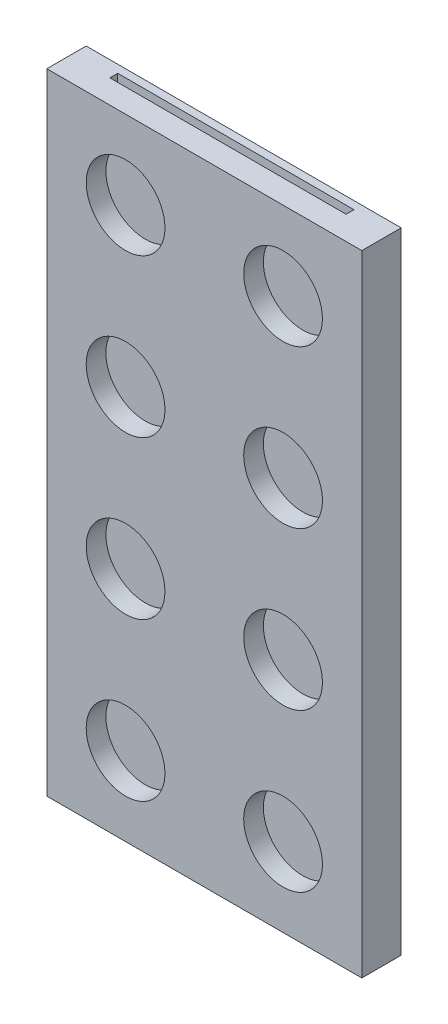
ISO-10303-21;
HEADER;
FILE_DESCRIPTION(('STEP AP214'),'2;1');
FILE_NAME('part.step','',(''),(''),'','','');
FILE_SCHEMA(('AUTOMOTIVE_DESIGN { 1 0 10303 214 1 1 1 1 }'));
ENDSEC;
DATA;
#1=APPLICATION_CONTEXT('core data for automotive mechanical design processes');
#2=APPLICATION_PROTOCOL_DEFINITION('international standard','automotive_design',2000,#1);
#3=PRODUCT_CONTEXT('',#1,'mechanical');
#4=PRODUCT('Part','Part','',(#3));
#5=PRODUCT_RELATED_PRODUCT_CATEGORY('part','',(#4));
#6=PRODUCT_DEFINITION_FORMATION('','',#4);
#7=PRODUCT_DEFINITION_CONTEXT('part definition',#1,'design');
#8=PRODUCT_DEFINITION('design','',#6,#7);
#9=PRODUCT_DEFINITION_SHAPE('','',#8);
#10=(LENGTH_UNIT() NAMED_UNIT(*) SI_UNIT(.MILLI.,.METRE.));
#11=(NAMED_UNIT(*) PLANE_ANGLE_UNIT() SI_UNIT($,.RADIAN.));
#12=(NAMED_UNIT(*) SI_UNIT($,.STERADIAN.) SOLID_ANGLE_UNIT());
#13=UNCERTAINTY_MEASURE_WITH_UNIT(LENGTH_MEASURE(1.E-05),#10,'distance_accuracy_value','');
#14=(GEOMETRIC_REPRESENTATION_CONTEXT(3) GLOBAL_UNCERTAINTY_ASSIGNED_CONTEXT((#13)) GLOBAL_UNIT_ASSIGNED_CONTEXT((#10,
#11,#12)) REPRESENTATION_CONTEXT('',''));
#15=CARTESIAN_POINT('',(0.,0.,0.));
#16=DIRECTION('',(0.,0.,1.));
#17=DIRECTION('',(1.,0.,0.));
#18=AXIS2_PLACEMENT_3D('',#15,#16,#17);
#19=CARTESIAN_POINT('',(0.,0.,6.35));
#20=DIRECTION('',(0.,0.,-1.));
#21=DIRECTION('',(-1.,0.,0.));
#22=AXIS2_PLACEMENT_3D('',#19,#20,#21);
#23=PLANE('',#22);
#24=CARTESIAN_POINT('',(12.7,63.5,6.35));
#25=DIRECTION('',(0.,0.,-1.));
#26=DIRECTION('',(-1.,0.,0.));
#27=AXIS2_PLACEMENT_3D('',#24,#25,#26);
#28=CIRCLE('',#27,6.35);
#29=CARTESIAN_POINT('',(6.35,63.5,6.35));
#30=VERTEX_POINT('',#29);
#31=EDGE_CURVE('E228',#30,#30,#28,.T.);
#32=ORIENTED_EDGE('',*,*,#31,.T.);
#33=EDGE_LOOP('',(#32));
#34=FACE_BOUND('',#33,.T.);
#35=CARTESIAN_POINT('',(12.7,38.1,6.35));
#36=DIRECTION('',(0.,0.,1.));
#37=DIRECTION('',(1.,0.,0.));
#38=AXIS2_PLACEMENT_3D('',#35,#36,#37);
#39=CIRCLE('',#38,6.35);
#40=CARTESIAN_POINT('',(19.05,38.1,6.35));
#41=VERTEX_POINT('',#40);
#42=EDGE_CURVE('E212',#41,#41,#39,.T.);
#43=ORIENTED_EDGE('',*,*,#42,.F.);
#44=EDGE_LOOP('',(#43));
#45=FACE_BOUND('',#44,.T.);
#46=CARTESIAN_POINT('',(38.1,63.5,6.35));
#47=DIRECTION('',(0.,0.,-1.));
#48=DIRECTION('',(-1.,0.,0.));
#49=AXIS2_PLACEMENT_3D('',#46,#47,#48);
#50=CIRCLE('',#49,6.35);
#51=CARTESIAN_POINT('',(31.75,63.5,6.35));
#52=VERTEX_POINT('',#51);
#53=EDGE_CURVE('E220',#52,#52,#50,.T.);
#54=ORIENTED_EDGE('',*,*,#53,.T.);
#55=EDGE_LOOP('',(#54));
#56=FACE_BOUND('',#55,.T.);
#57=CARTESIAN_POINT('',(38.1,38.1,6.35));
#58=DIRECTION('',(0.,0.,1.));
#59=DIRECTION('',(1.,0.,0.));
#60=AXIS2_PLACEMENT_3D('',#57,#58,#59);
#61=CIRCLE('',#60,6.35);
#62=CARTESIAN_POINT('',(44.45,38.1,6.35));
#63=VERTEX_POINT('',#62);
#64=EDGE_CURVE('E204',#63,#63,#61,.T.);
#65=ORIENTED_EDGE('',*,*,#64,.F.);
#66=EDGE_LOOP('',(#65));
#67=FACE_BOUND('',#66,.T.);
#68=CARTESIAN_POINT('',(12.7,12.7,6.35));
#69=DIRECTION('',(0.,0.,-1.));
#70=DIRECTION('',(-1.,0.,0.));
#71=AXIS2_PLACEMENT_3D('',#68,#69,#70);
#72=CIRCLE('',#71,6.35);
#73=CARTESIAN_POINT('',(6.35,12.7,6.35));
#74=VERTEX_POINT('',#73);
#75=EDGE_CURVE('E196',#74,#74,#72,.T.);
#76=ORIENTED_EDGE('',*,*,#75,.T.);
#77=EDGE_LOOP('',(#76));
#78=FACE_BOUND('',#77,.T.);
#79=DIRECTION('',(0.,-1.,0.));
#80=VECTOR('',#79,1.);
#81=CARTESIAN_POINT('',(0.,0.,6.35));
#82=LINE('',#81,#80);
#83=CARTESIAN_POINT('',(0.,101.6,6.35));
#84=VERTEX_POINT('',#83);
#85=CARTESIAN_POINT('',(0.,0.,6.35));
#86=VERTEX_POINT('',#85);
#87=EDGE_CURVE('E252',#84,#86,#82,.T.);
#88=ORIENTED_EDGE('',*,*,#87,.T.);
#89=DIRECTION('',(1.,0.,0.));
#90=VECTOR('',#89,1.);
#91=CARTESIAN_POINT('',(0.,0.,6.35));
#92=LINE('',#91,#90);
#93=CARTESIAN_POINT('',(50.8,0.,6.35));
#94=VERTEX_POINT('',#93);
#95=EDGE_CURVE('E256',#86,#94,#92,.T.);
#96=ORIENTED_EDGE('',*,*,#95,.T.);
#97=DIRECTION('',(0.,1.,0.));
#98=VECTOR('',#97,1.);
#99=CARTESIAN_POINT('',(50.8,0.,6.35));
#100=LINE('',#99,#98);
#101=CARTESIAN_POINT('',(50.8,101.6,6.35));
#102=VERTEX_POINT('',#101);
#103=EDGE_CURVE('E260',#94,#102,#100,.T.);
#104=ORIENTED_EDGE('',*,*,#103,.T.);
#105=DIRECTION('',(-1.,0.,0.));
#106=VECTOR('',#105,1.);
#107=CARTESIAN_POINT('',(0.,101.6,6.35));
#108=LINE('',#107,#106);
#109=EDGE_CURVE('E263',#102,#84,#108,.T.);
#110=ORIENTED_EDGE('',*,*,#109,.T.);
#111=EDGE_LOOP('',(#88,#96,#104,#110));
#112=FACE_BOUND('',#111,.T.);
#113=CARTESIAN_POINT('',(38.1,12.7,6.35));
#114=DIRECTION('',(0.,0.,-1.));
#115=DIRECTION('',(-1.,0.,0.));
#116=AXIS2_PLACEMENT_3D('',#113,#114,#115);
#117=CIRCLE('',#116,6.35);
#118=CARTESIAN_POINT('',(31.75,12.7,6.35));
#119=VERTEX_POINT('',#118);
#120=EDGE_CURVE('E188',#119,#119,#117,.T.);
#121=ORIENTED_EDGE('',*,*,#120,.T.);
#122=EDGE_LOOP('',(#121));
#123=FACE_BOUND('',#122,.T.);
#124=CARTESIAN_POINT('',(12.7,88.9,6.35));
#125=DIRECTION('',(0.,0.,1.));
#126=DIRECTION('',(1.,0.,0.));
#127=AXIS2_PLACEMENT_3D('',#124,#125,#126);
#128=CIRCLE('',#127,6.35);
#129=CARTESIAN_POINT('',(19.05,88.9,6.35));
#130=VERTEX_POINT('',#129);
#131=EDGE_CURVE('E244',#130,#130,#128,.T.);
#132=ORIENTED_EDGE('',*,*,#131,.F.);
#133=EDGE_LOOP('',(#132));
#134=FACE_BOUND('',#133,.T.);
#135=CARTESIAN_POINT('',(38.1,88.9,6.35));
#136=DIRECTION('',(0.,0.,1.));
#137=DIRECTION('',(1.,0.,0.));
#138=AXIS2_PLACEMENT_3D('',#135,#136,#137);
#139=CIRCLE('',#138,6.35);
#140=CARTESIAN_POINT('',(44.45,88.9,6.35));
#141=VERTEX_POINT('',#140);
#142=EDGE_CURVE('E236',#141,#141,#139,.T.);
#143=ORIENTED_EDGE('',*,*,#142,.F.);
#144=EDGE_LOOP('',(#143));
#145=FACE_BOUND('',#144,.T.);
#146=ADVANCED_FACE('F45',(#34,#45,#56,#67,#78,#112,#123,#134,#145),#23,.F.);
#147=CARTESIAN_POINT('',(0.,0.,6.35));
#148=DIRECTION('',(1.,0.,0.));
#149=DIRECTION('',(0.,0.,-1.));
#150=AXIS2_PLACEMENT_3D('',#147,#148,#149);
#151=PLANE('',#150);
#152=DIRECTION('',(0.,-1.,0.));
#153=VECTOR('',#152,1.);
#154=CARTESIAN_POINT('',(0.,0.,0.));
#155=LINE('',#154,#153);
#156=CARTESIAN_POINT('',(0.,101.6,0.));
#157=VERTEX_POINT('',#156);
#158=CARTESIAN_POINT('',(0.,0.,0.));
#159=VERTEX_POINT('',#158);
#160=EDGE_CURVE('E248',#157,#159,#155,.T.);
#161=ORIENTED_EDGE('',*,*,#160,.T.);
#162=DIRECTION('',(0.,0.,-1.));
#163=VECTOR('',#162,1.);
#164=CARTESIAN_POINT('',(0.,0.,6.35));
#165=LINE('',#164,#163);
#166=EDGE_CURVE('E11',#86,#159,#165,.T.);
#167=ORIENTED_EDGE('',*,*,#166,.F.);
#168=ORIENTED_EDGE('',*,*,#87,.F.);
#169=DIRECTION('',(0.,0.,-1.));
#170=VECTOR('',#169,1.);
#171=CARTESIAN_POINT('',(0.,101.6,6.35));
#172=LINE('',#171,#170);
#173=EDGE_CURVE('E266',#84,#157,#172,.T.);
#174=ORIENTED_EDGE('',*,*,#173,.T.);
#175=EDGE_LOOP('',(#161,#167,#168,#174));
#176=FACE_BOUND('',#175,.T.);
#177=ADVANCED_FACE('F47',(#176),#151,.F.);
#178=CARTESIAN_POINT('',(0.,0.,6.35));
#179=DIRECTION('',(0.,1.,0.));
#180=DIRECTION('',(0.,0.,1.));
#181=AXIS2_PLACEMENT_3D('',#178,#179,#180);
#182=PLANE('',#181);
#183=DIRECTION('',(1.,0.,0.));
#184=VECTOR('',#183,1.);
#185=CARTESIAN_POINT('',(0.,0.,0.));
#186=LINE('',#185,#184);
#187=CARTESIAN_POINT('',(50.8,0.,0.));
#188=VERTEX_POINT('',#187);
#189=EDGE_CURVE('E270',#159,#188,#186,.T.);
#190=ORIENTED_EDGE('',*,*,#189,.T.);
#191=DIRECTION('',(0.,0.,-1.));
#192=VECTOR('',#191,1.);
#193=CARTESIAN_POINT('',(50.8,0.,6.35));
#194=LINE('',#193,#192);
#195=EDGE_CURVE('E54',#94,#188,#194,.T.);
#196=ORIENTED_EDGE('',*,*,#195,.F.);
#197=ORIENTED_EDGE('',*,*,#95,.F.);
#198=ORIENTED_EDGE('',*,*,#166,.T.);
#199=EDGE_LOOP('',(#190,#196,#197,#198));
#200=FACE_BOUND('',#199,.T.);
#201=ADVANCED_FACE('F304',(#200),#182,.F.);
#202=CARTESIAN_POINT('',(50.8,0.,6.35));
#203=DIRECTION('',(-1.,0.,0.));
#204=DIRECTION('',(0.,0.,1.));
#205=AXIS2_PLACEMENT_3D('',#202,#203,#204);
#206=PLANE('',#205);
#207=DIRECTION('',(0.,1.,0.));
#208=VECTOR('',#207,1.);
#209=CARTESIAN_POINT('',(50.8,0.,0.));
#210=LINE('',#209,#208);
#211=CARTESIAN_POINT('',(50.8,101.6,0.));
#212=VERTEX_POINT('',#211);
#213=EDGE_CURVE('E273',#188,#212,#210,.T.);
#214=ORIENTED_EDGE('',*,*,#213,.T.);
#215=DIRECTION('',(0.,0.,-1.));
#216=VECTOR('',#215,1.);
#217=CARTESIAN_POINT('',(50.8,101.6,6.35));
#218=LINE('',#217,#216);
#219=EDGE_CURVE('E281',#102,#212,#218,.T.);
#220=ORIENTED_EDGE('',*,*,#219,.F.);
#221=ORIENTED_EDGE('',*,*,#103,.F.);
#222=ORIENTED_EDGE('',*,*,#195,.T.);
#223=EDGE_LOOP('',(#214,#220,#221,#222));
#224=FACE_BOUND('',#223,.T.);
#225=ADVANCED_FACE('F290',(#224),#206,.F.);
#226=CARTESIAN_POINT('',(0.,101.6,6.35));
#227=DIRECTION('',(0.,-1.,0.));
#228=DIRECTION('',(0.,0.,-1.));
#229=AXIS2_PLACEMENT_3D('',#226,#227,#228);
#230=PLANE('',#229);
#231=DIRECTION('',(1.,0.,0.));
#232=VECTOR('',#231,1.);
#233=CARTESIAN_POINT('',(44.45,101.6,2.54));
#234=LINE('',#233,#232);
#235=CARTESIAN_POINT('',(6.35,101.6,2.54));
#236=VERTEX_POINT('',#235);
#237=CARTESIAN_POINT('',(44.45,101.6,2.54));
#238=VERTEX_POINT('',#237);
#239=EDGE_CURVE('E136',#236,#238,#234,.T.);
#240=ORIENTED_EDGE('',*,*,#239,.F.);
#241=DIRECTION('',(0.,0.,1.));
#242=VECTOR('',#241,1.);
#243=CARTESIAN_POINT('',(6.35,101.6,2.54));
#244=LINE('',#243,#242);
#245=CARTESIAN_POINT('',(6.35,101.6,1.27));
#246=VERTEX_POINT('',#245);
#247=EDGE_CURVE('E141',#246,#236,#244,.T.);
#248=ORIENTED_EDGE('',*,*,#247,.F.);
#249=DIRECTION('',(-1.,0.,0.));
#250=VECTOR('',#249,1.);
#251=CARTESIAN_POINT('',(6.35,101.6,1.27));
#252=LINE('',#251,#250);
#253=CARTESIAN_POINT('',(44.45,101.6,1.27));
#254=VERTEX_POINT('',#253);
#255=EDGE_CURVE('E146',#254,#246,#252,.T.);
#256=ORIENTED_EDGE('',*,*,#255,.F.);
#257=DIRECTION('',(0.,0.,-1.));
#258=VECTOR('',#257,1.);
#259=CARTESIAN_POINT('',(44.45,101.6,1.27));
#260=LINE('',#259,#258);
#261=EDGE_CURVE('E127',#238,#254,#260,.T.);
#262=ORIENTED_EDGE('',*,*,#261,.F.);
#263=EDGE_LOOP('',(#240,#248,#256,#262));
#264=FACE_BOUND('',#263,.T.);
#265=DIRECTION('',(-1.,0.,0.));
#266=VECTOR('',#265,1.);
#267=CARTESIAN_POINT('',(0.,101.6,0.));
#268=LINE('',#267,#266);
#269=EDGE_CURVE('E257',#212,#157,#268,.T.);
#270=ORIENTED_EDGE('',*,*,#269,.T.);
#271=ORIENTED_EDGE('',*,*,#173,.F.);
#272=ORIENTED_EDGE('',*,*,#109,.F.);
#273=ORIENTED_EDGE('',*,*,#219,.T.);
#274=EDGE_LOOP('',(#270,#271,#272,#273));
#275=FACE_BOUND('',#274,.T.);
#276=ADVANCED_FACE('F143',(#264,#275),#230,.F.);
#277=CARTESIAN_POINT('',(0.,0.,0.));
#278=DIRECTION('',(0.,0.,-1.));
#279=DIRECTION('',(-1.,0.,0.));
#280=AXIS2_PLACEMENT_3D('',#277,#278,#279);
#281=PLANE('',#280);
#282=DIRECTION('',(0.,-1.,0.));
#283=VECTOR('',#282,1.);
#284=CARTESIAN_POINT('',(44.45,6.35,0.));
#285=LINE('',#284,#283);
#286=CARTESIAN_POINT('',(44.45,95.25,0.));
#287=VERTEX_POINT('',#286);
#288=CARTESIAN_POINT('',(44.45,6.35,0.));
#289=VERTEX_POINT('',#288);
#290=EDGE_CURVE('E69',#287,#289,#285,.T.);
#291=ORIENTED_EDGE('',*,*,#290,.F.);
#292=DIRECTION('',(1.,0.,0.));
#293=VECTOR('',#292,1.);
#294=CARTESIAN_POINT('',(44.45,95.25,0.));
#295=LINE('',#294,#293);
#296=CARTESIAN_POINT('',(6.35,95.25,0.));
#297=VERTEX_POINT('',#296);
#298=EDGE_CURVE('E133',#297,#287,#295,.T.);
#299=ORIENTED_EDGE('',*,*,#298,.F.);
#300=DIRECTION('',(0.,1.,0.));
#301=VECTOR('',#300,1.);
#302=CARTESIAN_POINT('',(6.35,95.25,0.));
#303=LINE('',#302,#301);
#304=CARTESIAN_POINT('',(6.34999999999999,6.35,0.));
#305=VERTEX_POINT('',#304);
#306=EDGE_CURVE('E169',#305,#297,#303,.T.);
#307=ORIENTED_EDGE('',*,*,#306,.F.);
#308=DIRECTION('',(-1.,0.,0.));
#309=VECTOR('',#308,1.);
#310=CARTESIAN_POINT('',(6.34999999999999,6.35,0.));
#311=LINE('',#310,#309);
#312=EDGE_CURVE('E165',#289,#305,#311,.T.);
#313=ORIENTED_EDGE('',*,*,#312,.F.);
#314=EDGE_LOOP('',(#291,#299,#307,#313));
#315=FACE_BOUND('',#314,.T.);
#316=ORIENTED_EDGE('',*,*,#160,.F.);
#317=ORIENTED_EDGE('',*,*,#269,.F.);
#318=ORIENTED_EDGE('',*,*,#213,.F.);
#319=ORIENTED_EDGE('',*,*,#189,.F.);
#320=EDGE_LOOP('',(#316,#317,#318,#319));
#321=FACE_BOUND('',#320,.T.);
#322=ADVANCED_FACE('F296',(#315,#321),#281,.T.);
#323=CARTESIAN_POINT('',(12.7,12.7,3.175));
#324=DIRECTION('',(0.,0.,1.));
#325=DIRECTION('',(1.,0.,0.));
#326=AXIS2_PLACEMENT_3D('',#323,#324,#325);
#327=CYLINDRICAL_SURFACE('',#326,6.35);
#328=CARTESIAN_POINT('',(12.7,12.7,3.175));
#329=DIRECTION('',(0.,0.,-1.));
#330=DIRECTION('',(-1.,0.,0.));
#331=AXIS2_PLACEMENT_3D('',#328,#329,#330);
#332=CIRCLE('',#331,6.35);
#333=CARTESIAN_POINT('',(6.35,12.7,3.175));
#334=VERTEX_POINT('',#333);
#335=EDGE_CURVE('E192',#334,#334,#332,.T.);
#336=ORIENTED_EDGE('',*,*,#335,.T.);
#337=EDGE_LOOP('',(#336));
#338=FACE_BOUND('',#337,.T.);
#339=ORIENTED_EDGE('',*,*,#75,.F.);
#340=EDGE_LOOP('',(#339));
#341=FACE_BOUND('',#340,.T.);
#342=ADVANCED_FACE('F324',(#338,#341),#327,.F.);
#343=CARTESIAN_POINT('',(12.7,12.7,3.175));
#344=DIRECTION('',(0.,0.,-1.));
#345=DIRECTION('',(-1.,0.,0.));
#346=AXIS2_PLACEMENT_3D('',#343,#344,#345);
#347=PLANE('',#346);
#348=ORIENTED_EDGE('',*,*,#335,.F.);
#349=EDGE_LOOP('',(#348));
#350=FACE_BOUND('',#349,.T.);
#351=ADVANCED_FACE('F519',(#350),#347,.F.);
#352=CARTESIAN_POINT('',(38.1,38.1,3.175));
#353=DIRECTION('',(0.,0.,1.));
#354=DIRECTION('',(1.,0.,0.));
#355=AXIS2_PLACEMENT_3D('',#352,#353,#354);
#356=CYLINDRICAL_SURFACE('',#355,6.35);
#357=CARTESIAN_POINT('',(38.1,38.1,3.175));
#358=DIRECTION('',(0.,0.,1.));
#359=DIRECTION('',(1.,0.,0.));
#360=AXIS2_PLACEMENT_3D('',#357,#358,#359);
#361=CIRCLE('',#360,6.35);
#362=CARTESIAN_POINT('',(44.45,38.1,3.175));
#363=VERTEX_POINT('',#362);
#364=EDGE_CURVE('E200',#363,#363,#361,.T.);
#365=ORIENTED_EDGE('',*,*,#364,.F.);
#366=EDGE_LOOP('',(#365));
#367=FACE_BOUND('',#366,.T.);
#368=ORIENTED_EDGE('',*,*,#64,.T.);
#369=EDGE_LOOP('',(#368));
#370=FACE_BOUND('',#369,.T.);
#371=ADVANCED_FACE('F510',(#367,#370),#356,.F.);
#372=CARTESIAN_POINT('',(38.1,38.1,3.175));
#373=DIRECTION('',(0.,0.,1.));
#374=DIRECTION('',(1.,0.,0.));
#375=AXIS2_PLACEMENT_3D('',#372,#373,#374);
#376=PLANE('',#375);
#377=ORIENTED_EDGE('',*,*,#364,.T.);
#378=EDGE_LOOP('',(#377));
#379=FACE_BOUND('',#378,.T.);
#380=ADVANCED_FACE('F501',(#379),#376,.T.);
#381=CARTESIAN_POINT('',(38.1,12.7,3.175));
#382=DIRECTION('',(0.,0.,1.));
#383=DIRECTION('',(1.,0.,0.));
#384=AXIS2_PLACEMENT_3D('',#381,#382,#383);
#385=CYLINDRICAL_SURFACE('',#384,6.35);
#386=CARTESIAN_POINT('',(38.1,12.7,3.175));
#387=DIRECTION('',(0.,0.,-1.));
#388=DIRECTION('',(-1.,0.,0.));
#389=AXIS2_PLACEMENT_3D('',#386,#387,#388);
#390=CIRCLE('',#389,6.35);
#391=CARTESIAN_POINT('',(31.75,12.7,3.175));
#392=VERTEX_POINT('',#391);
#393=EDGE_CURVE('E179',#392,#392,#390,.T.);
#394=ORIENTED_EDGE('',*,*,#393,.T.);
#395=EDGE_LOOP('',(#394));
#396=FACE_BOUND('',#395,.T.);
#397=ORIENTED_EDGE('',*,*,#120,.F.);
#398=EDGE_LOOP('',(#397));
#399=FACE_BOUND('',#398,.T.);
#400=ADVANCED_FACE('F492',(#396,#399),#385,.F.);
#401=CARTESIAN_POINT('',(38.1,12.7,3.175));
#402=DIRECTION('',(0.,0.,-1.));
#403=DIRECTION('',(-1.,0.,0.));
#404=AXIS2_PLACEMENT_3D('',#401,#402,#403);
#405=PLANE('',#404);
#406=ORIENTED_EDGE('',*,*,#393,.F.);
#407=EDGE_LOOP('',(#406));
#408=FACE_BOUND('',#407,.T.);
#409=ADVANCED_FACE('F484',(#408),#405,.F.);
#410=CARTESIAN_POINT('',(12.7,88.9,3.175));
#411=DIRECTION('',(0.,0.,1.));
#412=DIRECTION('',(1.,0.,0.));
#413=AXIS2_PLACEMENT_3D('',#410,#411,#412);
#414=CYLINDRICAL_SURFACE('',#413,6.35);
#415=CARTESIAN_POINT('',(12.7,88.9,3.175));
#416=DIRECTION('',(0.,0.,1.));
#417=DIRECTION('',(1.,0.,0.));
#418=AXIS2_PLACEMENT_3D('',#415,#416,#417);
#419=CIRCLE('',#418,6.35);
#420=CARTESIAN_POINT('',(19.05,88.9,3.175));
#421=VERTEX_POINT('',#420);
#422=EDGE_CURVE('E240',#421,#421,#419,.T.);
#423=ORIENTED_EDGE('',*,*,#422,.F.);
#424=EDGE_LOOP('',(#423));
#425=FACE_BOUND('',#424,.T.);
#426=ORIENTED_EDGE('',*,*,#131,.T.);
#427=EDGE_LOOP('',(#426));
#428=FACE_BOUND('',#427,.T.);
#429=ADVANCED_FACE('F476',(#425,#428),#414,.F.);
#430=CARTESIAN_POINT('',(12.7,88.9,3.175));
#431=DIRECTION('',(0.,0.,1.));
#432=DIRECTION('',(1.,0.,0.));
#433=AXIS2_PLACEMENT_3D('',#430,#431,#432);
#434=PLANE('',#433);
#435=ORIENTED_EDGE('',*,*,#422,.T.);
#436=EDGE_LOOP('',(#435));
#437=FACE_BOUND('',#436,.T.);
#438=ADVANCED_FACE('F320',(#437),#434,.T.);
#439=CARTESIAN_POINT('',(38.1,63.5,3.175));
#440=DIRECTION('',(0.,0.,1.));
#441=DIRECTION('',(1.,0.,0.));
#442=AXIS2_PLACEMENT_3D('',#439,#440,#441);
#443=CYLINDRICAL_SURFACE('',#442,6.35);
#444=CARTESIAN_POINT('',(38.1,63.5,3.175));
#445=DIRECTION('',(0.,0.,-1.));
#446=DIRECTION('',(-1.,0.,0.));
#447=AXIS2_PLACEMENT_3D('',#444,#445,#446);
#448=CIRCLE('',#447,6.35);
#449=CARTESIAN_POINT('',(31.75,63.5,3.175));
#450=VERTEX_POINT('',#449);
#451=EDGE_CURVE('E216',#450,#450,#448,.T.);
#452=ORIENTED_EDGE('',*,*,#451,.T.);
#453=EDGE_LOOP('',(#452));
#454=FACE_BOUND('',#453,.T.);
#455=ORIENTED_EDGE('',*,*,#53,.F.);
#456=EDGE_LOOP('',(#455));
#457=FACE_BOUND('',#456,.T.);
#458=ADVANCED_FACE('F459',(#454,#457),#443,.F.);
#459=CARTESIAN_POINT('',(38.1,63.5,3.175));
#460=DIRECTION('',(0.,0.,-1.));
#461=DIRECTION('',(-1.,0.,0.));
#462=AXIS2_PLACEMENT_3D('',#459,#460,#461);
#463=PLANE('',#462);
#464=ORIENTED_EDGE('',*,*,#451,.F.);
#465=EDGE_LOOP('',(#464));
#466=FACE_BOUND('',#465,.T.);
#467=ADVANCED_FACE('F450',(#466),#463,.F.);
#468=CARTESIAN_POINT('',(12.7,38.1,3.175));
#469=DIRECTION('',(0.,0.,1.));
#470=DIRECTION('',(1.,0.,0.));
#471=AXIS2_PLACEMENT_3D('',#468,#469,#470);
#472=CYLINDRICAL_SURFACE('',#471,6.35);
#473=CARTESIAN_POINT('',(12.7,38.1,3.175));
#474=DIRECTION('',(0.,0.,1.));
#475=DIRECTION('',(1.,0.,0.));
#476=AXIS2_PLACEMENT_3D('',#473,#474,#475);
#477=CIRCLE('',#476,6.35);
#478=CARTESIAN_POINT('',(19.05,38.1,3.175));
#479=VERTEX_POINT('',#478);
#480=EDGE_CURVE('E208',#479,#479,#477,.T.);
#481=ORIENTED_EDGE('',*,*,#480,.F.);
#482=EDGE_LOOP('',(#481));
#483=FACE_BOUND('',#482,.T.);
#484=ORIENTED_EDGE('',*,*,#42,.T.);
#485=EDGE_LOOP('',(#484));
#486=FACE_BOUND('',#485,.T.);
#487=ADVANCED_FACE('F441',(#483,#486),#472,.F.);
#488=CARTESIAN_POINT('',(12.7,38.1,3.175));
#489=DIRECTION('',(0.,0.,1.));
#490=DIRECTION('',(1.,0.,0.));
#491=AXIS2_PLACEMENT_3D('',#488,#489,#490);
#492=PLANE('',#491);
#493=ORIENTED_EDGE('',*,*,#480,.T.);
#494=EDGE_LOOP('',(#493));
#495=FACE_BOUND('',#494,.T.);
#496=ADVANCED_FACE('F432',(#495),#492,.T.);
#497=CARTESIAN_POINT('',(38.1,88.9,3.175));
#498=DIRECTION('',(0.,0.,1.));
#499=DIRECTION('',(1.,0.,0.));
#500=AXIS2_PLACEMENT_3D('',#497,#498,#499);
#501=CYLINDRICAL_SURFACE('',#500,6.35);
#502=CARTESIAN_POINT('',(38.1,88.9,3.175));
#503=DIRECTION('',(0.,0.,1.));
#504=DIRECTION('',(1.,0.,0.));
#505=AXIS2_PLACEMENT_3D('',#502,#503,#504);
#506=CIRCLE('',#505,6.35);
#507=CARTESIAN_POINT('',(44.45,88.9,3.175));
#508=VERTEX_POINT('',#507);
#509=EDGE_CURVE('E232',#508,#508,#506,.T.);
#510=ORIENTED_EDGE('',*,*,#509,.F.);
#511=EDGE_LOOP('',(#510));
#512=FACE_BOUND('',#511,.T.);
#513=ORIENTED_EDGE('',*,*,#142,.T.);
#514=EDGE_LOOP('',(#513));
#515=FACE_BOUND('',#514,.T.);
#516=ADVANCED_FACE('F423',(#512,#515),#501,.F.);
#517=CARTESIAN_POINT('',(38.1,88.9,3.175));
#518=DIRECTION('',(0.,0.,1.));
#519=DIRECTION('',(1.,0.,0.));
#520=AXIS2_PLACEMENT_3D('',#517,#518,#519);
#521=PLANE('',#520);
#522=ORIENTED_EDGE('',*,*,#509,.T.);
#523=EDGE_LOOP('',(#522));
#524=FACE_BOUND('',#523,.T.);
#525=ADVANCED_FACE('F414',(#524),#521,.T.);
#526=CARTESIAN_POINT('',(12.7,63.5,3.175));
#527=DIRECTION('',(0.,0.,1.));
#528=DIRECTION('',(1.,0.,0.));
#529=AXIS2_PLACEMENT_3D('',#526,#527,#528);
#530=CYLINDRICAL_SURFACE('',#529,6.35);
#531=CARTESIAN_POINT('',(12.7,63.5,3.175));
#532=DIRECTION('',(0.,0.,-1.));
#533=DIRECTION('',(-1.,0.,0.));
#534=AXIS2_PLACEMENT_3D('',#531,#532,#533);
#535=CIRCLE('',#534,6.35);
#536=CARTESIAN_POINT('',(6.35,63.5,3.175));
#537=VERTEX_POINT('',#536);
#538=EDGE_CURVE('E224',#537,#537,#535,.T.);
#539=ORIENTED_EDGE('',*,*,#538,.T.);
#540=EDGE_LOOP('',(#539));
#541=FACE_BOUND('',#540,.T.);
#542=ORIENTED_EDGE('',*,*,#31,.F.);
#543=EDGE_LOOP('',(#542));
#544=FACE_BOUND('',#543,.T.);
#545=ADVANCED_FACE('F405',(#541,#544),#530,.F.);
#546=CARTESIAN_POINT('',(12.7,63.5,3.175));
#547=DIRECTION('',(0.,0.,-1.));
#548=DIRECTION('',(-1.,0.,0.));
#549=AXIS2_PLACEMENT_3D('',#546,#547,#548);
#550=PLANE('',#549);
#551=ORIENTED_EDGE('',*,*,#538,.F.);
#552=EDGE_LOOP('',(#551));
#553=FACE_BOUND('',#552,.T.);
#554=ADVANCED_FACE('F343',(#553),#550,.F.);
#555=CARTESIAN_POINT('',(44.45,6.35,2.54));
#556=DIRECTION('',(1.,0.,0.));
#557=DIRECTION('',(0.,0.,-1.));
#558=AXIS2_PLACEMENT_3D('',#555,#556,#557);
#559=PLANE('',#558);
#560=ORIENTED_EDGE('',*,*,#290,.T.);
#561=DIRECTION('',(0.,0.,-1.));
#562=VECTOR('',#561,1.);
#563=CARTESIAN_POINT('',(44.45,6.35,2.54));
#564=LINE('',#563,#562);
#565=CARTESIAN_POINT('',(44.45,6.35,2.54));
#566=VERTEX_POINT('',#565);
#567=EDGE_CURVE('E129',#566,#289,#564,.T.);
#568=ORIENTED_EDGE('',*,*,#567,.F.);
#569=DIRECTION('',(0.,-1.,0.));
#570=VECTOR('',#569,1.);
#571=CARTESIAN_POINT('',(44.45,6.35,2.54));
#572=LINE('',#571,#570);
#573=EDGE_CURVE('E124',#238,#566,#572,.T.);
#574=ORIENTED_EDGE('',*,*,#573,.F.);
#575=ORIENTED_EDGE('',*,*,#261,.T.);
#576=DIRECTION('',(0.,1.,0.));
#577=VECTOR('',#576,1.);
#578=CARTESIAN_POINT('',(44.45,-0.001000000000001,1.27));
#579=LINE('',#578,#577);
#580=CARTESIAN_POINT('',(44.45,95.25,1.27));
#581=VERTEX_POINT('',#580);
#582=EDGE_CURVE('E150',#581,#254,#579,.T.);
#583=ORIENTED_EDGE('',*,*,#582,.F.);
#584=DIRECTION('',(0.,0.,-1.));
#585=VECTOR('',#584,1.);
#586=CARTESIAN_POINT('',(44.45,95.25,2.54));
#587=LINE('',#586,#585);
#588=EDGE_CURVE('E176',#581,#287,#587,.T.);
#589=ORIENTED_EDGE('',*,*,#588,.T.);
#590=EDGE_LOOP('',(#560,#568,#574,#575,#583,#589));
#591=FACE_BOUND('',#590,.T.);
#592=ADVANCED_FACE('F125',(#591),#559,.F.);
#593=CARTESIAN_POINT('',(44.45,95.25,2.54));
#594=DIRECTION('',(0.,1.,0.));
#595=DIRECTION('',(0.,0.,1.));
#596=AXIS2_PLACEMENT_3D('',#593,#594,#595);
#597=PLANE('',#596);
#598=ORIENTED_EDGE('',*,*,#588,.F.);
#599=DIRECTION('',(1.,0.,0.));
#600=VECTOR('',#599,1.);
#601=CARTESIAN_POINT('',(6.35,95.25,1.27));
#602=LINE('',#601,#600);
#603=CARTESIAN_POINT('',(6.35,95.25,1.27));
#604=VERTEX_POINT('',#603);
#605=EDGE_CURVE('E613',#604,#581,#602,.T.);
#606=ORIENTED_EDGE('',*,*,#605,.F.);
#607=DIRECTION('',(0.,0.,-1.));
#608=VECTOR('',#607,1.);
#609=CARTESIAN_POINT('',(6.35,95.25,2.54));
#610=LINE('',#609,#608);
#611=EDGE_CURVE('E180',#604,#297,#610,.T.);
#612=ORIENTED_EDGE('',*,*,#611,.T.);
#613=ORIENTED_EDGE('',*,*,#298,.T.);
#614=EDGE_LOOP('',(#598,#606,#612,#613));
#615=FACE_BOUND('',#614,.T.);
#616=ADVANCED_FACE('F342',(#615),#597,.F.);
#617=CARTESIAN_POINT('',(6.35,95.25,2.54));
#618=DIRECTION('',(-1.,0.,0.));
#619=DIRECTION('',(0.,-1.,0.));
#620=AXIS2_PLACEMENT_3D('',#617,#618,#619);
#621=PLANE('',#620);
#622=ORIENTED_EDGE('',*,*,#306,.T.);
#623=ORIENTED_EDGE('',*,*,#611,.F.);
#624=DIRECTION('',(0.,1.,0.));
#625=VECTOR('',#624,1.);
#626=CARTESIAN_POINT('',(6.35,-0.001000000000001,1.27));
#627=LINE('',#626,#625);
#628=EDGE_CURVE('E154',#604,#246,#627,.T.);
#629=ORIENTED_EDGE('',*,*,#628,.T.);
#630=ORIENTED_EDGE('',*,*,#247,.T.);
#631=DIRECTION('',(0.,1.,0.));
#632=VECTOR('',#631,1.);
#633=CARTESIAN_POINT('',(6.35,95.25,2.54));
#634=LINE('',#633,#632);
#635=CARTESIAN_POINT('',(6.34999999999999,6.35,2.54));
#636=VERTEX_POINT('',#635);
#637=EDGE_CURVE('E61',#636,#236,#634,.T.);
#638=ORIENTED_EDGE('',*,*,#637,.F.);
#639=DIRECTION('',(0.,0.,-1.));
#640=VECTOR('',#639,1.);
#641=CARTESIAN_POINT('',(6.34999999999999,6.35,2.54));
#642=LINE('',#641,#640);
#643=EDGE_CURVE('E183',#636,#305,#642,.T.);
#644=ORIENTED_EDGE('',*,*,#643,.T.);
#645=EDGE_LOOP('',(#622,#623,#629,#630,#638,#644));
#646=FACE_BOUND('',#645,.T.);
#647=ADVANCED_FACE('F353',(#646),#621,.F.);
#648=CARTESIAN_POINT('',(6.34999999999999,6.35,2.54));
#649=DIRECTION('',(0.,-1.,0.));
#650=DIRECTION('',(1.,0.,0.));
#651=AXIS2_PLACEMENT_3D('',#648,#649,#650);
#652=PLANE('',#651);
#653=ORIENTED_EDGE('',*,*,#312,.T.);
#654=ORIENTED_EDGE('',*,*,#643,.F.);
#655=DIRECTION('',(-1.,0.,0.));
#656=VECTOR('',#655,1.);
#657=CARTESIAN_POINT('',(6.34999999999999,6.35,2.54));
#658=LINE('',#657,#656);
#659=EDGE_CURVE('E132',#566,#636,#658,.T.);
#660=ORIENTED_EDGE('',*,*,#659,.F.);
#661=ORIENTED_EDGE('',*,*,#567,.T.);
#662=EDGE_LOOP('',(#653,#654,#660,#661));
#663=FACE_BOUND('',#662,.T.);
#664=ADVANCED_FACE('F336',(#663),#652,.F.);
#665=CARTESIAN_POINT('',(0.,0.,2.54));
#666=DIRECTION('',(0.,0.,1.));
#667=DIRECTION('',(1.,0.,0.));
#668=AXIS2_PLACEMENT_3D('',#665,#666,#667);
#669=PLANE('',#668);
#670=ORIENTED_EDGE('',*,*,#573,.T.);
#671=ORIENTED_EDGE('',*,*,#659,.T.);
#672=ORIENTED_EDGE('',*,*,#637,.T.);
#673=ORIENTED_EDGE('',*,*,#239,.T.);
#674=EDGE_LOOP('',(#670,#671,#672,#673));
#675=FACE_BOUND('',#674,.T.);
#676=ADVANCED_FACE('F137',(#675),#669,.F.);
#677=CARTESIAN_POINT('',(6.35,-0.001000000000001,1.27));
#678=DIRECTION('',(0.,0.,-1.));
#679=DIRECTION('',(-1.,0.,0.));
#680=AXIS2_PLACEMENT_3D('',#677,#678,#679);
#681=PLANE('',#680);
#682=ORIENTED_EDGE('',*,*,#605,.T.);
#683=ORIENTED_EDGE('',*,*,#582,.T.);
#684=ORIENTED_EDGE('',*,*,#255,.T.);
#685=ORIENTED_EDGE('',*,*,#628,.F.);
#686=EDGE_LOOP('',(#682,#683,#684,#685));
#687=FACE_BOUND('',#686,.T.);
#688=ADVANCED_FACE('F369',(#687),#681,.F.);
#689=CLOSED_SHELL('',(#146,#177,#201,#225,#276,#322,#342,#351,#371,#380,#400,#409,#429,#438,
#458,#467,#487,#496,#516,#525,#545,#554,#592,#616,#647,#664,#676,#688));
#690=MANIFOLD_SOLID_BREP('B2',#689);
#691=ADVANCED_BREP_SHAPE_REPRESENTATION('',(#18,#690),#14);
#692=SHAPE_DEFINITION_REPRESENTATION(#9,#691);
ENDSEC;
END-ISO-10303-21;
